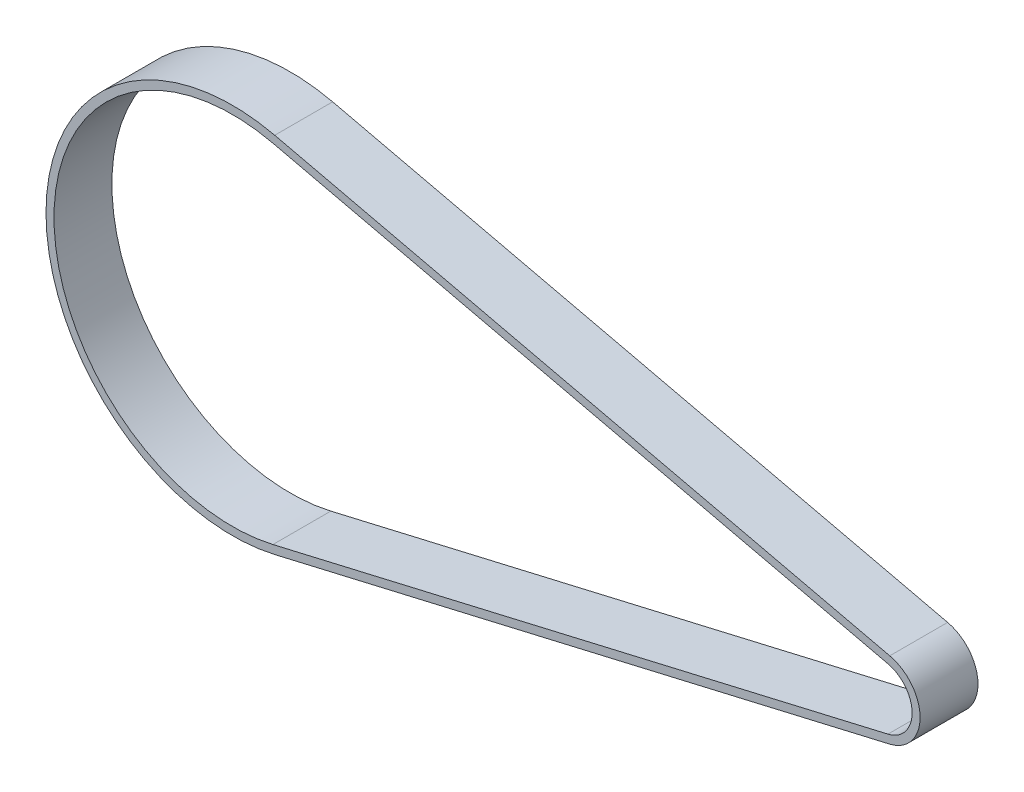
ISO-10303-21;
HEADER;
FILE_DESCRIPTION(('STEP AP214'),'2;1');
FILE_NAME('part.step','',(''),(''),'','','');
FILE_SCHEMA(('AUTOMOTIVE_DESIGN { 1 0 10303 214 1 1 1 1 }'));
ENDSEC;
DATA;
#1=APPLICATION_CONTEXT('core data for automotive mechanical design processes');
#2=APPLICATION_PROTOCOL_DEFINITION('international standard','automotive_design',2000,#1);
#3=PRODUCT_CONTEXT('',#1,'mechanical');
#4=PRODUCT('Part','Part','',(#3));
#5=PRODUCT_RELATED_PRODUCT_CATEGORY('part','',(#4));
#6=PRODUCT_DEFINITION_FORMATION('','',#4);
#7=PRODUCT_DEFINITION_CONTEXT('part definition',#1,'design');
#8=PRODUCT_DEFINITION('design','',#6,#7);
#9=PRODUCT_DEFINITION_SHAPE('','',#8);
#10=(LENGTH_UNIT() NAMED_UNIT(*) SI_UNIT(.MILLI.,.METRE.));
#11=(NAMED_UNIT(*) PLANE_ANGLE_UNIT() SI_UNIT($,.RADIAN.));
#12=(NAMED_UNIT(*) SI_UNIT($,.STERADIAN.) SOLID_ANGLE_UNIT());
#13=UNCERTAINTY_MEASURE_WITH_UNIT(LENGTH_MEASURE(1.E-05),#10,'distance_accuracy_value','');
#14=(GEOMETRIC_REPRESENTATION_CONTEXT(3) GLOBAL_UNCERTAINTY_ASSIGNED_CONTEXT((#13)) GLOBAL_UNIT_ASSIGNED_CONTEXT((#10,
#11,#12)) REPRESENTATION_CONTEXT('',''));
#15=CARTESIAN_POINT('',(0.,0.,0.));
#16=DIRECTION('',(0.,0.,1.));
#17=DIRECTION('',(1.,0.,0.));
#18=AXIS2_PLACEMENT_3D('',#15,#16,#17);
#19=CARTESIAN_POINT('',(112.,0.,-10.));
#20=DIRECTION('',(0.,0.,1.));
#21=DIRECTION('',(1.,0.,0.));
#22=AXIS2_PLACEMENT_3D('',#19,#20,#21);
#23=CYLINDRICAL_SURFACE('',#22,6.7830025);
#24=CARTESIAN_POINT('',(112.,0.,0.));
#25=DIRECTION('',(0.,0.,1.));
#26=DIRECTION('',(1.,0.,0.));
#27=AXIS2_PLACEMENT_3D('',#24,#25,#26);
#28=CIRCLE('',#27,6.7830025);
#29=CARTESIAN_POINT('',(113.539407595471,-6.60600841431598,0.));
#30=VERTEX_POINT('',#29);
#31=CARTESIAN_POINT('',(113.539407595471,6.60600841431597,0.));
#32=VERTEX_POINT('',#31);
#33=EDGE_CURVE('E130',#30,#32,#28,.T.);
#34=ORIENTED_EDGE('',*,*,#33,.F.);
#35=DIRECTION('',(0.,0.,1.));
#36=VECTOR('',#35,1.);
#37=CARTESIAN_POINT('',(113.539407595471,-6.60600841431598,-10.));
#38=LINE('',#37,#36);
#39=CARTESIAN_POINT('',(113.539407595471,-6.60600841431598,-10.));
#40=VERTEX_POINT('',#39);
#41=EDGE_CURVE('E11',#40,#30,#38,.T.);
#42=ORIENTED_EDGE('',*,*,#41,.F.);
#43=CARTESIAN_POINT('',(112.,0.,-10.));
#44=DIRECTION('',(0.,0.,1.));
#45=DIRECTION('',(1.,0.,0.));
#46=AXIS2_PLACEMENT_3D('',#43,#44,#45);
#47=CIRCLE('',#46,6.7830025);
#48=CARTESIAN_POINT('',(113.539407595471,6.60600841431597,-10.));
#49=VERTEX_POINT('',#48);
#50=EDGE_CURVE('E134',#40,#49,#47,.T.);
#51=ORIENTED_EDGE('',*,*,#50,.T.);
#52=DIRECTION('',(0.,0.,1.));
#53=VECTOR('',#52,1.);
#54=CARTESIAN_POINT('',(113.539407595471,6.60600841431597,-10.));
#55=LINE('',#54,#53);
#56=EDGE_CURVE('E35',#49,#32,#55,.T.);
#57=ORIENTED_EDGE('',*,*,#56,.T.);
#58=EDGE_LOOP('',(#34,#42,#51,#57));
#59=FACE_BOUND('',#58,.T.);
#60=ADVANCED_FACE('F32',(#59),#23,.T.);
#61=CARTESIAN_POINT('',(113.539407595471,-6.60600841431598,-10.));
#62=DIRECTION('',(0.226950763392857,-0.97390623316385,0.));
#63=DIRECTION('',(0.97390623316385,0.226950763392857,0.));
#64=AXIS2_PLACEMENT_3D('',#61,#62,#63);
#65=PLANE('',#64);
#66=DIRECTION('',(0.97390623316385,0.226950763392857,0.));
#67=VECTOR('',#66,1.);
#68=CARTESIAN_POINT('',(113.539407595471,-6.60600841431598,0.));
#69=LINE('',#68,#67);
#70=CARTESIAN_POINT('',(7.30815228398593,-31.3612298803509,0.));
#71=VERTEX_POINT('',#70);
#72=EDGE_CURVE('E138',#71,#30,#69,.T.);
#73=ORIENTED_EDGE('',*,*,#72,.F.);
#74=DIRECTION('',(0.,0.,1.));
#75=VECTOR('',#74,1.);
#76=CARTESIAN_POINT('',(7.30815228398593,-31.3612298803509,-10.));
#77=LINE('',#76,#75);
#78=CARTESIAN_POINT('',(7.30815228398593,-31.3612298803509,-10.));
#79=VERTEX_POINT('',#78);
#80=EDGE_CURVE('E40',#79,#71,#77,.T.);
#81=ORIENTED_EDGE('',*,*,#80,.F.);
#82=DIRECTION('',(0.97390623316385,0.226950763392857,0.));
#83=VECTOR('',#82,1.);
#84=CARTESIAN_POINT('',(113.539407595471,-6.60600841431598,-10.));
#85=LINE('',#84,#83);
#86=EDGE_CURVE('E144',#79,#40,#85,.T.);
#87=ORIENTED_EDGE('',*,*,#86,.T.);
#88=ORIENTED_EDGE('',*,*,#41,.T.);
#89=EDGE_LOOP('',(#73,#81,#87,#88));
#90=FACE_BOUND('',#89,.T.);
#91=ADVANCED_FACE('F170',(#90),#65,.T.);
#92=CARTESIAN_POINT('',(0.,0.,-10.));
#93=DIRECTION('',(0.,0.,1.));
#94=DIRECTION('',(1.,0.,0.));
#95=AXIS2_PLACEMENT_3D('',#92,#93,#94);
#96=CYLINDRICAL_SURFACE('',#95,32.201488);
#97=CARTESIAN_POINT('',(0.,0.,0.));
#98=DIRECTION('',(0.,0.,1.));
#99=DIRECTION('',(1.,0.,0.));
#100=AXIS2_PLACEMENT_3D('',#97,#98,#99);
#101=CIRCLE('',#100,32.201488);
#102=CARTESIAN_POINT('',(7.30815228398594,31.3612298803509,0.));
#103=VERTEX_POINT('',#102);
#104=EDGE_CURVE('E152',#103,#71,#101,.T.);
#105=ORIENTED_EDGE('',*,*,#104,.F.);
#106=DIRECTION('',(0.,0.,1.));
#107=VECTOR('',#106,1.);
#108=CARTESIAN_POINT('',(7.30815228398594,31.3612298803509,-10.));
#109=LINE('',#108,#107);
#110=CARTESIAN_POINT('',(7.30815228398594,31.3612298803509,-10.));
#111=VERTEX_POINT('',#110);
#112=EDGE_CURVE('E157',#111,#103,#109,.T.);
#113=ORIENTED_EDGE('',*,*,#112,.F.);
#114=CARTESIAN_POINT('',(0.,0.,-10.));
#115=DIRECTION('',(0.,0.,1.));
#116=DIRECTION('',(1.,0.,0.));
#117=AXIS2_PLACEMENT_3D('',#114,#115,#116);
#118=CIRCLE('',#117,32.201488);
#119=EDGE_CURVE('E141',#111,#79,#118,.T.);
#120=ORIENTED_EDGE('',*,*,#119,.T.);
#121=ORIENTED_EDGE('',*,*,#80,.T.);
#122=EDGE_LOOP('',(#105,#113,#120,#121));
#123=FACE_BOUND('',#122,.T.);
#124=ADVANCED_FACE('F174',(#123),#96,.T.);
#125=CARTESIAN_POINT('',(7.30815228398593,31.3612298803509,-10.));
#126=DIRECTION('',(0.226950763392857,0.97390623316385,0.));
#127=DIRECTION('',(-0.97390623316385,0.226950763392857,0.));
#128=AXIS2_PLACEMENT_3D('',#125,#126,#127);
#129=PLANE('',#128);
#130=DIRECTION('',(-0.97390623316385,0.226950763392857,0.));
#131=VECTOR('',#130,1.);
#132=CARTESIAN_POINT('',(7.30815228398593,31.3612298803509,0.));
#133=LINE('',#132,#131);
#134=EDGE_CURVE('E149',#32,#103,#133,.T.);
#135=ORIENTED_EDGE('',*,*,#134,.F.);
#136=ORIENTED_EDGE('',*,*,#56,.F.);
#137=DIRECTION('',(-0.97390623316385,0.226950763392857,0.));
#138=VECTOR('',#137,1.);
#139=CARTESIAN_POINT('',(7.30815228398593,31.3612298803509,-10.));
#140=LINE('',#139,#138);
#141=EDGE_CURVE('E137',#49,#111,#140,.T.);
#142=ORIENTED_EDGE('',*,*,#141,.T.);
#143=ORIENTED_EDGE('',*,*,#112,.T.);
#144=EDGE_LOOP('',(#135,#136,#142,#143));
#145=FACE_BOUND('',#144,.T.);
#146=ADVANCED_FACE('F165',(#145),#129,.T.);
#147=CARTESIAN_POINT('',(112.,0.,-10.));
#148=DIRECTION('',(0.,0.,1.));
#149=DIRECTION('',(1.,0.,0.));
#150=AXIS2_PLACEMENT_3D('',#147,#148,#149);
#151=PLANE('',#150);
#152=DIRECTION('',(-0.97390623316385,0.226950763392857,0.));
#153=VECTOR('',#152,1.);
#154=CARTESIAN_POINT('',(6.99496023050379,30.0172392785848,-10.));
#155=LINE('',#154,#153);
#156=CARTESIAN_POINT('',(113.226215541989,5.26201781254987,-10.));
#157=VERTEX_POINT('',#156);
#158=CARTESIAN_POINT('',(6.99496023050379,30.0172392785848,-10.));
#159=VERTEX_POINT('',#158);
#160=EDGE_CURVE('E105',#157,#159,#155,.T.);
#161=ORIENTED_EDGE('',*,*,#160,.T.);
#162=CARTESIAN_POINT('',(0.,0.,-10.));
#163=DIRECTION('',(0.,0.,1.));
#164=DIRECTION('',(1.,0.,0.));
#165=AXIS2_PLACEMENT_3D('',#162,#163,#164);
#166=CIRCLE('',#165,30.821488);
#167=CARTESIAN_POINT('',(6.99496023050379,-30.0172392785848,-10.));
#168=VERTEX_POINT('',#167);
#169=EDGE_CURVE('E99',#159,#168,#166,.T.);
#170=ORIENTED_EDGE('',*,*,#169,.T.);
#171=DIRECTION('',(0.97390623316385,0.226950763392857,0.));
#172=VECTOR('',#171,1.);
#173=CARTESIAN_POINT('',(113.226215541989,-5.26201781254987,-10.));
#174=LINE('',#173,#172);
#175=CARTESIAN_POINT('',(113.226215541989,-5.26201781254987,-10.));
#176=VERTEX_POINT('',#175);
#177=EDGE_CURVE('E108',#168,#176,#174,.T.);
#178=ORIENTED_EDGE('',*,*,#177,.T.);
#179=CARTESIAN_POINT('',(112.,0.,-10.));
#180=DIRECTION('',(0.,0.,1.));
#181=DIRECTION('',(1.,0.,0.));
#182=AXIS2_PLACEMENT_3D('',#179,#180,#181);
#183=CIRCLE('',#182,5.4030025);
#184=EDGE_CURVE('E48',#176,#157,#183,.T.);
#185=ORIENTED_EDGE('',*,*,#184,.T.);
#186=EDGE_LOOP('',(#161,#170,#178,#185));
#187=FACE_BOUND('',#186,.T.);
#188=ORIENTED_EDGE('',*,*,#50,.F.);
#189=ORIENTED_EDGE('',*,*,#86,.F.);
#190=ORIENTED_EDGE('',*,*,#119,.F.);
#191=ORIENTED_EDGE('',*,*,#141,.F.);
#192=EDGE_LOOP('',(#188,#189,#190,#191));
#193=FACE_BOUND('',#192,.T.);
#194=ADVANCED_FACE('F112',(#187,#193),#151,.F.);
#195=CARTESIAN_POINT('',(112.,0.,0.));
#196=DIRECTION('',(0.,0.,1.));
#197=DIRECTION('',(1.,0.,0.));
#198=AXIS2_PLACEMENT_3D('',#195,#196,#197);
#199=PLANE('',#198);
#200=CARTESIAN_POINT('',(0.,0.,0.));
#201=DIRECTION('',(0.,0.,1.));
#202=DIRECTION('',(1.,0.,0.));
#203=AXIS2_PLACEMENT_3D('',#200,#201,#202);
#204=CIRCLE('',#203,30.821488);
#205=CARTESIAN_POINT('',(6.99496023050379,30.0172392785848,0.));
#206=VERTEX_POINT('',#205);
#207=CARTESIAN_POINT('',(6.99496023050379,-30.0172392785848,0.));
#208=VERTEX_POINT('',#207);
#209=EDGE_CURVE('E56',#206,#208,#204,.T.);
#210=ORIENTED_EDGE('',*,*,#209,.F.);
#211=DIRECTION('',(-0.97390623316385,0.226950763392857,0.));
#212=VECTOR('',#211,1.);
#213=CARTESIAN_POINT('',(6.99496023050379,30.0172392785848,0.));
#214=LINE('',#213,#212);
#215=CARTESIAN_POINT('',(113.226215541989,5.26201781254987,0.));
#216=VERTEX_POINT('',#215);
#217=EDGE_CURVE('E115',#216,#206,#214,.T.);
#218=ORIENTED_EDGE('',*,*,#217,.F.);
#219=CARTESIAN_POINT('',(112.,0.,0.));
#220=DIRECTION('',(0.,0.,1.));
#221=DIRECTION('',(1.,0.,0.));
#222=AXIS2_PLACEMENT_3D('',#219,#220,#221);
#223=CIRCLE('',#222,5.4030025);
#224=CARTESIAN_POINT('',(113.226215541989,-5.26201781254987,0.));
#225=VERTEX_POINT('',#224);
#226=EDGE_CURVE('E118',#225,#216,#223,.T.);
#227=ORIENTED_EDGE('',*,*,#226,.F.);
#228=DIRECTION('',(0.97390623316385,0.226950763392857,0.));
#229=VECTOR('',#228,1.);
#230=CARTESIAN_POINT('',(113.226215541989,-5.26201781254987,0.));
#231=LINE('',#230,#229);
#232=EDGE_CURVE('E124',#208,#225,#231,.T.);
#233=ORIENTED_EDGE('',*,*,#232,.F.);
#234=EDGE_LOOP('',(#210,#218,#227,#233));
#235=FACE_BOUND('',#234,.T.);
#236=ORIENTED_EDGE('',*,*,#33,.T.);
#237=ORIENTED_EDGE('',*,*,#134,.T.);
#238=ORIENTED_EDGE('',*,*,#104,.T.);
#239=ORIENTED_EDGE('',*,*,#72,.T.);
#240=EDGE_LOOP('',(#236,#237,#238,#239));
#241=FACE_BOUND('',#240,.T.);
#242=ADVANCED_FACE('F167',(#235,#241),#199,.T.);
#243=CARTESIAN_POINT('',(0.,0.,-10.));
#244=DIRECTION('',(0.,0.,1.));
#245=DIRECTION('',(1.,0.,0.));
#246=AXIS2_PLACEMENT_3D('',#243,#244,#245);
#247=CYLINDRICAL_SURFACE('',#246,30.821488);
#248=ORIENTED_EDGE('',*,*,#209,.T.);
#249=DIRECTION('',(0.,0.,1.));
#250=VECTOR('',#249,1.);
#251=CARTESIAN_POINT('',(6.99496023050379,-30.0172392785848,-10.));
#252=LINE('',#251,#250);
#253=EDGE_CURVE('E95',#168,#208,#252,.T.);
#254=ORIENTED_EDGE('',*,*,#253,.F.);
#255=ORIENTED_EDGE('',*,*,#169,.F.);
#256=DIRECTION('',(0.,0.,1.));
#257=VECTOR('',#256,1.);
#258=CARTESIAN_POINT('',(6.99496023050379,30.0172392785848,-10.));
#259=LINE('',#258,#257);
#260=EDGE_CURVE('E128',#159,#206,#259,.T.);
#261=ORIENTED_EDGE('',*,*,#260,.T.);
#262=EDGE_LOOP('',(#248,#254,#255,#261));
#263=FACE_BOUND('',#262,.T.);
#264=ADVANCED_FACE('F97',(#263),#247,.F.);
#265=CARTESIAN_POINT('',(6.99496023050379,30.0172392785848,-10.));
#266=DIRECTION('',(0.226950763392857,0.97390623316385,0.));
#267=DIRECTION('',(-0.97390623316385,0.226950763392857,0.));
#268=AXIS2_PLACEMENT_3D('',#265,#266,#267);
#269=PLANE('',#268);
#270=ORIENTED_EDGE('',*,*,#217,.T.);
#271=ORIENTED_EDGE('',*,*,#260,.F.);
#272=ORIENTED_EDGE('',*,*,#160,.F.);
#273=DIRECTION('',(0.,0.,1.));
#274=VECTOR('',#273,1.);
#275=CARTESIAN_POINT('',(113.226215541989,5.26201781254987,-10.));
#276=LINE('',#275,#274);
#277=EDGE_CURVE('E131',#157,#216,#276,.T.);
#278=ORIENTED_EDGE('',*,*,#277,.T.);
#279=EDGE_LOOP('',(#270,#271,#272,#278));
#280=FACE_BOUND('',#279,.T.);
#281=ADVANCED_FACE('F225',(#280),#269,.F.);
#282=CARTESIAN_POINT('',(112.,0.,-10.));
#283=DIRECTION('',(0.,0.,1.));
#284=DIRECTION('',(1.,0.,0.));
#285=AXIS2_PLACEMENT_3D('',#282,#283,#284);
#286=CYLINDRICAL_SURFACE('',#285,5.4030025);
#287=ORIENTED_EDGE('',*,*,#226,.T.);
#288=ORIENTED_EDGE('',*,*,#277,.F.);
#289=ORIENTED_EDGE('',*,*,#184,.F.);
#290=DIRECTION('',(0.,0.,1.));
#291=VECTOR('',#290,1.);
#292=CARTESIAN_POINT('',(113.226215541989,-5.26201781254987,-10.));
#293=LINE('',#292,#291);
#294=EDGE_CURVE('E104',#176,#225,#293,.T.);
#295=ORIENTED_EDGE('',*,*,#294,.T.);
#296=EDGE_LOOP('',(#287,#288,#289,#295));
#297=FACE_BOUND('',#296,.T.);
#298=ADVANCED_FACE('F234',(#297),#286,.F.);
#299=CARTESIAN_POINT('',(113.226215541989,-5.26201781254987,-10.));
#300=DIRECTION('',(0.226950763392857,-0.97390623316385,0.));
#301=DIRECTION('',(0.97390623316385,0.226950763392857,0.));
#302=AXIS2_PLACEMENT_3D('',#299,#300,#301);
#303=PLANE('',#302);
#304=ORIENTED_EDGE('',*,*,#232,.T.);
#305=ORIENTED_EDGE('',*,*,#294,.F.);
#306=ORIENTED_EDGE('',*,*,#177,.F.);
#307=ORIENTED_EDGE('',*,*,#253,.T.);
#308=EDGE_LOOP('',(#304,#305,#306,#307));
#309=FACE_BOUND('',#308,.T.);
#310=ADVANCED_FACE('F109',(#309),#303,.F.);
#311=CLOSED_SHELL('',(#60,#91,#124,#146,#194,#242,#264,#281,#298,#310));
#312=MANIFOLD_SOLID_BREP('B2',#311);
#313=ADVANCED_BREP_SHAPE_REPRESENTATION('',(#18,#312),#14);
#314=SHAPE_DEFINITION_REPRESENTATION(#9,#313);
ENDSEC;
END-ISO-10303-21;
